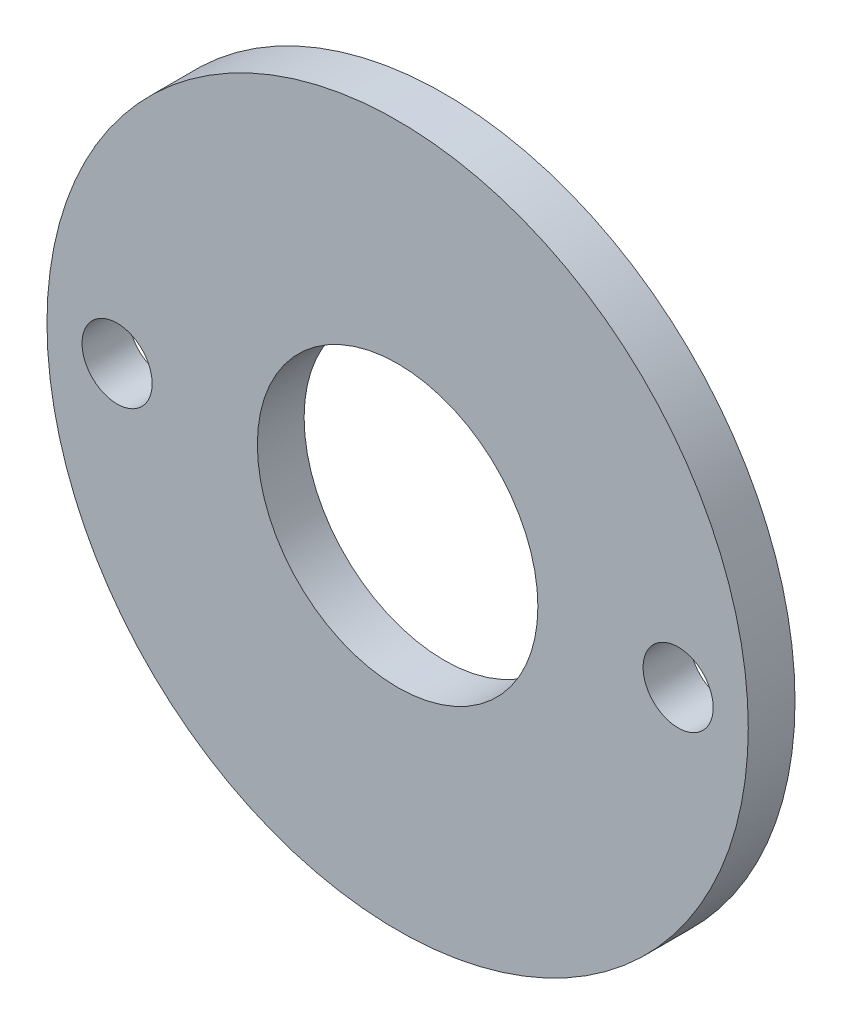
ISO-10303-21;
HEADER;
FILE_DESCRIPTION(('STEP AP214'),'2;1');
FILE_NAME('part.step','',(''),(''),'','','');
FILE_SCHEMA(('AUTOMOTIVE_DESIGN { 1 0 10303 214 1 1 1 1 }'));
ENDSEC;
DATA;
#1=APPLICATION_CONTEXT('core data for automotive mechanical design processes');
#2=APPLICATION_PROTOCOL_DEFINITION('international standard','automotive_design',2000,#1);
#3=PRODUCT_CONTEXT('',#1,'mechanical');
#4=PRODUCT('Part','Part','',(#3));
#5=PRODUCT_RELATED_PRODUCT_CATEGORY('part','',(#4));
#6=PRODUCT_DEFINITION_FORMATION('','',#4);
#7=PRODUCT_DEFINITION_CONTEXT('part definition',#1,'design');
#8=PRODUCT_DEFINITION('design','',#6,#7);
#9=PRODUCT_DEFINITION_SHAPE('','',#8);
#10=(LENGTH_UNIT() NAMED_UNIT(*) SI_UNIT(.MILLI.,.METRE.));
#11=(NAMED_UNIT(*) PLANE_ANGLE_UNIT() SI_UNIT($,.RADIAN.));
#12=(NAMED_UNIT(*) SI_UNIT($,.STERADIAN.) SOLID_ANGLE_UNIT());
#13=UNCERTAINTY_MEASURE_WITH_UNIT(LENGTH_MEASURE(1.E-05),#10,'distance_accuracy_value','');
#14=(GEOMETRIC_REPRESENTATION_CONTEXT(3) GLOBAL_UNCERTAINTY_ASSIGNED_CONTEXT((#13)) GLOBAL_UNIT_ASSIGNED_CONTEXT((#10,
#11,#12)) REPRESENTATION_CONTEXT('',''));
#15=CARTESIAN_POINT('',(0.,0.,0.));
#16=DIRECTION('',(0.,0.,1.));
#17=DIRECTION('',(1.,0.,0.));
#18=AXIS2_PLACEMENT_3D('',#15,#16,#17);
#19=CARTESIAN_POINT('',(0.,0.,2.));
#20=DIRECTION('',(0.,0.,1.));
#21=DIRECTION('',(1.,0.,0.));
#22=AXIS2_PLACEMENT_3D('',#19,#20,#21);
#23=PLANE('',#22);
#24=CARTESIAN_POINT('',(12.,0.,2.));
#25=DIRECTION('',(0.,0.,1.));
#26=DIRECTION('',(1.,0.,0.));
#27=AXIS2_PLACEMENT_3D('',#24,#25,#26);
#28=CIRCLE('',#27,1.5);
#29=CARTESIAN_POINT('',(13.5,0.,2.));
#30=VERTEX_POINT('',#29);
#31=EDGE_CURVE('E56',#30,#30,#28,.T.);
#32=ORIENTED_EDGE('',*,*,#31,.F.);
#33=EDGE_LOOP('',(#32));
#34=FACE_BOUND('',#33,.T.);
#35=CARTESIAN_POINT('',(0.,0.,2.));
#36=DIRECTION('',(0.,0.,1.));
#37=DIRECTION('',(1.,0.,0.));
#38=AXIS2_PLACEMENT_3D('',#35,#36,#37);
#39=CIRCLE('',#38,15.);
#40=CARTESIAN_POINT('',(15.,0.,2.));
#41=VERTEX_POINT('',#40);
#42=EDGE_CURVE('E10',#41,#41,#39,.T.);
#43=ORIENTED_EDGE('',*,*,#42,.T.);
#44=EDGE_LOOP('',(#43));
#45=FACE_BOUND('',#44,.T.);
#46=CARTESIAN_POINT('',(0.,0.,2.));
#47=DIRECTION('',(0.,0.,1.));
#48=DIRECTION('',(1.,0.,0.));
#49=AXIS2_PLACEMENT_3D('',#46,#47,#48);
#50=CIRCLE('',#49,6.);
#51=CARTESIAN_POINT('',(6.,0.,2.));
#52=VERTEX_POINT('',#51);
#53=EDGE_CURVE('E50',#52,#52,#50,.T.);
#54=ORIENTED_EDGE('',*,*,#53,.F.);
#55=EDGE_LOOP('',(#54));
#56=FACE_BOUND('',#55,.T.);
#57=CARTESIAN_POINT('',(-12.,0.,2.));
#58=DIRECTION('',(0.,0.,1.));
#59=DIRECTION('',(1.,0.,0.));
#60=AXIS2_PLACEMENT_3D('',#57,#58,#59);
#61=CIRCLE('',#60,1.5);
#62=CARTESIAN_POINT('',(-10.5,0.,2.));
#63=VERTEX_POINT('',#62);
#64=EDGE_CURVE('E64',#63,#63,#61,.T.);
#65=ORIENTED_EDGE('',*,*,#64,.F.);
#66=EDGE_LOOP('',(#65));
#67=FACE_BOUND('',#66,.T.);
#68=ADVANCED_FACE('F37',(#34,#45,#56,#67),#23,.T.);
#69=CARTESIAN_POINT('',(0.,0.,0.));
#70=DIRECTION('',(0.,0.,1.));
#71=DIRECTION('',(1.,0.,0.));
#72=AXIS2_PLACEMENT_3D('',#69,#70,#71);
#73=PLANE('',#72);
#74=CARTESIAN_POINT('',(0.,0.,0.));
#75=DIRECTION('',(0.,0.,1.));
#76=DIRECTION('',(1.,0.,0.));
#77=AXIS2_PLACEMENT_3D('',#74,#75,#76);
#78=CIRCLE('',#77,15.);
#79=CARTESIAN_POINT('',(15.,0.,0.));
#80=VERTEX_POINT('',#79);
#81=EDGE_CURVE('E41',#80,#80,#78,.T.);
#82=ORIENTED_EDGE('',*,*,#81,.F.);
#83=EDGE_LOOP('',(#82));
#84=FACE_BOUND('',#83,.T.);
#85=CARTESIAN_POINT('',(0.,0.,0.));
#86=DIRECTION('',(0.,0.,1.));
#87=DIRECTION('',(1.,0.,0.));
#88=AXIS2_PLACEMENT_3D('',#85,#86,#87);
#89=CIRCLE('',#88,6.);
#90=CARTESIAN_POINT('',(6.,0.,0.));
#91=VERTEX_POINT('',#90);
#92=EDGE_CURVE('E52',#91,#91,#89,.T.);
#93=ORIENTED_EDGE('',*,*,#92,.T.);
#94=EDGE_LOOP('',(#93));
#95=FACE_BOUND('',#94,.T.);
#96=CARTESIAN_POINT('',(12.,0.,0.));
#97=DIRECTION('',(0.,0.,1.));
#98=DIRECTION('',(1.,0.,0.));
#99=AXIS2_PLACEMENT_3D('',#96,#97,#98);
#100=CIRCLE('',#99,1.5);
#101=CARTESIAN_POINT('',(13.5,0.,0.));
#102=VERTEX_POINT('',#101);
#103=EDGE_CURVE('E60',#102,#102,#100,.T.);
#104=ORIENTED_EDGE('',*,*,#103,.T.);
#105=EDGE_LOOP('',(#104));
#106=FACE_BOUND('',#105,.T.);
#107=CARTESIAN_POINT('',(-12.,0.,0.));
#108=DIRECTION('',(0.,0.,1.));
#109=DIRECTION('',(1.,0.,0.));
#110=AXIS2_PLACEMENT_3D('',#107,#108,#109);
#111=CIRCLE('',#110,1.5);
#112=CARTESIAN_POINT('',(-10.5,0.,0.));
#113=VERTEX_POINT('',#112);
#114=EDGE_CURVE('E68',#113,#113,#111,.T.);
#115=ORIENTED_EDGE('',*,*,#114,.T.);
#116=EDGE_LOOP('',(#115));
#117=FACE_BOUND('',#116,.T.);
#118=ADVANCED_FACE('F80',(#84,#95,#106,#117),#73,.F.);
#119=CARTESIAN_POINT('',(0.,0.,2.));
#120=DIRECTION('',(0.,0.,-1.));
#121=DIRECTION('',(-1.,0.,0.));
#122=AXIS2_PLACEMENT_3D('',#119,#120,#121);
#123=CYLINDRICAL_SURFACE('',#122,15.);
#124=ORIENTED_EDGE('',*,*,#42,.F.);
#125=EDGE_LOOP('',(#124));
#126=FACE_BOUND('',#125,.T.);
#127=ORIENTED_EDGE('',*,*,#81,.T.);
#128=EDGE_LOOP('',(#127));
#129=FACE_BOUND('',#128,.T.);
#130=ADVANCED_FACE('F39',(#126,#129),#123,.T.);
#131=CARTESIAN_POINT('',(0.,0.,2.));
#132=DIRECTION('',(0.,0.,-1.));
#133=DIRECTION('',(-1.,0.,0.));
#134=AXIS2_PLACEMENT_3D('',#131,#132,#133);
#135=CYLINDRICAL_SURFACE('',#134,6.);
#136=ORIENTED_EDGE('',*,*,#53,.T.);
#137=EDGE_LOOP('',(#136));
#138=FACE_BOUND('',#137,.T.);
#139=ORIENTED_EDGE('',*,*,#92,.F.);
#140=EDGE_LOOP('',(#139));
#141=FACE_BOUND('',#140,.T.);
#142=ADVANCED_FACE('F89',(#138,#141),#135,.F.);
#143=CARTESIAN_POINT('',(12.,0.,2.));
#144=DIRECTION('',(0.,0.,-1.));
#145=DIRECTION('',(-1.,0.,0.));
#146=AXIS2_PLACEMENT_3D('',#143,#144,#145);
#147=CYLINDRICAL_SURFACE('',#146,1.5);
#148=ORIENTED_EDGE('',*,*,#31,.T.);
#149=EDGE_LOOP('',(#148));
#150=FACE_BOUND('',#149,.T.);
#151=ORIENTED_EDGE('',*,*,#103,.F.);
#152=EDGE_LOOP('',(#151));
#153=FACE_BOUND('',#152,.T.);
#154=ADVANCED_FACE('F92',(#150,#153),#147,.F.);
#155=CARTESIAN_POINT('',(-12.,0.,2.));
#156=DIRECTION('',(0.,0.,-1.));
#157=DIRECTION('',(-1.,0.,0.));
#158=AXIS2_PLACEMENT_3D('',#155,#156,#157);
#159=CYLINDRICAL_SURFACE('',#158,1.5);
#160=ORIENTED_EDGE('',*,*,#64,.T.);
#161=EDGE_LOOP('',(#160));
#162=FACE_BOUND('',#161,.T.);
#163=ORIENTED_EDGE('',*,*,#114,.F.);
#164=EDGE_LOOP('',(#163));
#165=FACE_BOUND('',#164,.T.);
#166=ADVANCED_FACE('F76',(#162,#165),#159,.F.);
#167=CLOSED_SHELL('',(#68,#118,#130,#142,#154,#166));
#168=MANIFOLD_SOLID_BREP('B2',#167);
#169=ADVANCED_BREP_SHAPE_REPRESENTATION('',(#18,#168),#14);
#170=SHAPE_DEFINITION_REPRESENTATION(#9,#169);
ENDSEC;
END-ISO-10303-21;
